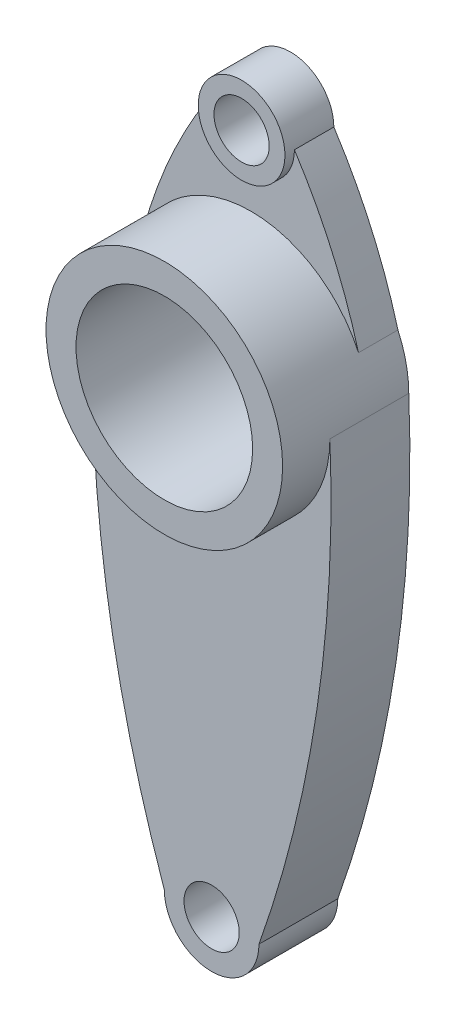
ISO-10303-21;
HEADER;
FILE_DESCRIPTION(('STEP AP214'),'2;1');
FILE_NAME('part.step','',(''),(''),'','','');
FILE_SCHEMA(('AUTOMOTIVE_DESIGN { 1 0 10303 214 1 1 1 1 }'));
ENDSEC;
DATA;
#1=APPLICATION_CONTEXT('core data for automotive mechanical design processes');
#2=APPLICATION_PROTOCOL_DEFINITION('international standard','automotive_design',2000,#1);
#3=PRODUCT_CONTEXT('',#1,'mechanical');
#4=PRODUCT('Part','Part','',(#3));
#5=PRODUCT_RELATED_PRODUCT_CATEGORY('part','',(#4));
#6=PRODUCT_DEFINITION_FORMATION('','',#4);
#7=PRODUCT_DEFINITION_CONTEXT('part definition',#1,'design');
#8=PRODUCT_DEFINITION('design','',#6,#7);
#9=PRODUCT_DEFINITION_SHAPE('','',#8);
#10=(LENGTH_UNIT() NAMED_UNIT(*) SI_UNIT(.MILLI.,.METRE.));
#11=(NAMED_UNIT(*) PLANE_ANGLE_UNIT() SI_UNIT($,.RADIAN.));
#12=(NAMED_UNIT(*) SI_UNIT($,.STERADIAN.) SOLID_ANGLE_UNIT());
#13=UNCERTAINTY_MEASURE_WITH_UNIT(LENGTH_MEASURE(1.E-05),#10,'distance_accuracy_value','');
#14=(GEOMETRIC_REPRESENTATION_CONTEXT(3) GLOBAL_UNCERTAINTY_ASSIGNED_CONTEXT((#13)) GLOBAL_UNIT_ASSIGNED_CONTEXT((#10,
#11,#12)) REPRESENTATION_CONTEXT('',''));
#15=CARTESIAN_POINT('',(0.,0.,0.));
#16=DIRECTION('',(0.,0.,1.));
#17=DIRECTION('',(1.,0.,0.));
#18=AXIS2_PLACEMENT_3D('',#15,#16,#17);
#19=CARTESIAN_POINT('',(0.,0.,5.));
#20=DIRECTION('',(0.,0.,-1.));
#21=DIRECTION('',(-1.,0.,0.));
#22=AXIS2_PLACEMENT_3D('',#19,#20,#21);
#23=PLANE('',#22);
#24=CARTESIAN_POINT('',(0.,24.5,5.));
#25=DIRECTION('',(0.,0.,1.));
#26=DIRECTION('',(1.,0.,0.));
#27=AXIS2_PLACEMENT_3D('',#24,#25,#26);
#28=CIRCLE('',#27,5.5);
#29=CARTESIAN_POINT('',(-5.5,24.5,5.));
#30=VERTEX_POINT('',#29);
#31=CARTESIAN_POINT('',(5.5,24.5,5.));
#32=VERTEX_POINT('',#31);
#33=EDGE_CURVE('E156',#30,#32,#28,.T.);
#34=ORIENTED_EDGE('',*,*,#33,.F.);
#35=CARTESIAN_POINT('',(49.102505457268,-10.7642368099611,5.));
#36=DIRECTION('',(0.,0.,-1.));
#37=DIRECTION('',(-1.,0.,0.));
#38=AXIS2_PLACEMENT_3D('',#35,#36,#37);
#39=CIRCLE('',#38,65.);
#40=CARTESIAN_POINT('',(-13.6243897035963,6.27503029510925,5.));
#41=VERTEX_POINT('',#40);
#42=EDGE_CURVE('E139',#30,#41,#39,.F.);
#43=ORIENTED_EDGE('',*,*,#42,.T.);
#44=CARTESIAN_POINT('',(0.,0.,5.));
#45=DIRECTION('',(0.,0.,-1.));
#46=DIRECTION('',(-1.,0.,0.));
#47=AXIS2_PLACEMENT_3D('',#44,#45,#46);
#48=CIRCLE('',#47,15.);
#49=CARTESIAN_POINT('',(13.6243897035963,6.27503029510925,5.));
#50=VERTEX_POINT('',#49);
#51=EDGE_CURVE('E161',#41,#50,#48,.T.);
#52=ORIENTED_EDGE('',*,*,#51,.T.);
#53=CARTESIAN_POINT('',(-49.102505457268,-10.7642368099611,5.));
#54=DIRECTION('',(0.,0.,-1.));
#55=DIRECTION('',(-1.,0.,0.));
#56=AXIS2_PLACEMENT_3D('',#53,#54,#55);
#57=CIRCLE('',#56,65.);
#58=EDGE_CURVE('E149',#32,#50,#57,.T.);
#59=ORIENTED_EDGE('',*,*,#58,.F.);
#60=EDGE_LOOP('',(#34,#43,#52,#59));
#61=FACE_BOUND('',#60,.T.);
#62=ADVANCED_FACE('F75',(#61),#23,.F.);
#63=CARTESIAN_POINT('',(0.,0.,16.));
#64=DIRECTION('',(0.,0.,1.));
#65=DIRECTION('',(1.,0.,0.));
#66=AXIS2_PLACEMENT_3D('',#63,#64,#65);
#67=PLANE('',#66);
#68=CARTESIAN_POINT('',(0.,0.,16.));
#69=DIRECTION('',(0.,0.,1.));
#70=DIRECTION('',(1.,0.,0.));
#71=AXIS2_PLACEMENT_3D('',#68,#69,#70);
#72=CIRCLE('',#71,15.);
#73=CARTESIAN_POINT('',(15.,0.,16.));
#74=VERTEX_POINT('',#73);
#75=EDGE_CURVE('E12',#74,#74,#72,.T.);
#76=ORIENTED_EDGE('',*,*,#75,.T.);
#77=EDGE_LOOP('',(#76));
#78=FACE_BOUND('',#77,.T.);
#79=CARTESIAN_POINT('',(0.,0.,16.));
#80=DIRECTION('',(0.,0.,1.));
#81=DIRECTION('',(1.,0.,0.));
#82=AXIS2_PLACEMENT_3D('',#79,#80,#81);
#83=CIRCLE('',#82,11.2);
#84=CARTESIAN_POINT('',(11.2,0.,16.));
#85=VERTEX_POINT('',#84);
#86=EDGE_CURVE('E220',#85,#85,#83,.T.);
#87=ORIENTED_EDGE('',*,*,#86,.F.);
#88=EDGE_LOOP('',(#87));
#89=FACE_BOUND('',#88,.T.);
#90=ADVANCED_FACE('F244',(#78,#89),#67,.T.);
#91=CARTESIAN_POINT('',(0.,0.,0.));
#92=DIRECTION('',(0.,0.,1.));
#93=DIRECTION('',(1.,0.,0.));
#94=AXIS2_PLACEMENT_3D('',#91,#92,#93);
#95=PLANE('',#94);
#96=CARTESIAN_POINT('',(0.,0.,0.));
#97=DIRECTION('',(0.,0.,1.));
#98=DIRECTION('',(1.,0.,0.));
#99=AXIS2_PLACEMENT_3D('',#96,#97,#98);
#100=CIRCLE('',#99,15.);
#101=CARTESIAN_POINT('',(-13.6243897035963,6.27503029510925,0.));
#102=VERTEX_POINT('',#101);
#103=CARTESIAN_POINT('',(-15.,-5.46437894932694E-13,0.));
#104=VERTEX_POINT('',#103);
#105=EDGE_CURVE('E79',#102,#104,#100,.T.);
#106=ORIENTED_EDGE('',*,*,#105,.F.);
#107=CARTESIAN_POINT('',(49.102505457268,-10.7642368099611,0.));
#108=DIRECTION('',(0.,0.,-1.));
#109=DIRECTION('',(-1.,0.,0.));
#110=AXIS2_PLACEMENT_3D('',#107,#108,#109);
#111=CIRCLE('',#110,65.);
#112=CARTESIAN_POINT('',(-5.5,24.5,0.));
#113=VERTEX_POINT('',#112);
#114=EDGE_CURVE('E200',#113,#102,#111,.F.);
#115=ORIENTED_EDGE('',*,*,#114,.F.);
#116=CARTESIAN_POINT('',(0.,24.5,0.));
#117=DIRECTION('',(0.,0.,-1.));
#118=DIRECTION('',(-1.,0.,0.));
#119=AXIS2_PLACEMENT_3D('',#116,#117,#118);
#120=CIRCLE('',#119,5.5);
#121=CARTESIAN_POINT('',(5.5,24.5,0.));
#122=VERTEX_POINT('',#121);
#123=EDGE_CURVE('E158',#122,#113,#120,.F.);
#124=ORIENTED_EDGE('',*,*,#123,.F.);
#125=CARTESIAN_POINT('',(-49.102505457268,-10.7642368099611,0.));
#126=DIRECTION('',(0.,0.,-1.));
#127=DIRECTION('',(-1.,0.,0.));
#128=AXIS2_PLACEMENT_3D('',#125,#126,#127);
#129=CIRCLE('',#128,65.);
#130=CARTESIAN_POINT('',(13.6243897035963,6.27503029510924,0.));
#131=VERTEX_POINT('',#130);
#132=EDGE_CURVE('E209',#122,#131,#129,.T.);
#133=ORIENTED_EDGE('',*,*,#132,.T.);
#134=CARTESIAN_POINT('',(15.,0.,0.));
#135=VERTEX_POINT('',#134);
#136=EDGE_CURVE('E223',#135,#131,#100,.T.);
#137=ORIENTED_EDGE('',*,*,#136,.F.);
#138=CARTESIAN_POINT('',(-144.859823688835,-6.69602644667472,0.));
#139=DIRECTION('',(0.,0.,-1.));
#140=DIRECTION('',(-1.,0.,0.));
#141=AXIS2_PLACEMENT_3D('',#138,#139,#140);
#142=CIRCLE('',#141,160.);
#143=CARTESIAN_POINT('',(5.99999999999999,-60.,0.));
#144=VERTEX_POINT('',#143);
#145=EDGE_CURVE('E193',#135,#144,#142,.T.);
#146=ORIENTED_EDGE('',*,*,#145,.T.);
#147=CARTESIAN_POINT('',(0.,-60.,0.));
#148=DIRECTION('',(0.,0.,-1.));
#149=DIRECTION('',(-1.,0.,0.));
#150=AXIS2_PLACEMENT_3D('',#147,#148,#149);
#151=CIRCLE('',#150,6.);
#152=CARTESIAN_POINT('',(-6.00000000000001,-60.,0.));
#153=VERTEX_POINT('',#152);
#154=EDGE_CURVE('E169',#144,#153,#151,.T.);
#155=ORIENTED_EDGE('',*,*,#154,.T.);
#156=CARTESIAN_POINT('',(144.859823688835,-6.69602644667476,0.));
#157=DIRECTION('',(0.,0.,-1.));
#158=DIRECTION('',(-1.,0.,0.));
#159=AXIS2_PLACEMENT_3D('',#156,#157,#158);
#160=CIRCLE('',#159,160.);
#161=EDGE_CURVE('E190',#104,#153,#160,.F.);
#162=ORIENTED_EDGE('',*,*,#161,.F.);
#163=EDGE_LOOP('',(#106,#115,#124,#133,#137,#146,#155,#162));
#164=FACE_BOUND('',#163,.T.);
#165=CARTESIAN_POINT('',(0.,0.,0.));
#166=DIRECTION('',(0.,0.,1.));
#167=DIRECTION('',(1.,0.,0.));
#168=AXIS2_PLACEMENT_3D('',#165,#166,#167);
#169=CIRCLE('',#168,11.2);
#170=CARTESIAN_POINT('',(11.2,0.,0.));
#171=VERTEX_POINT('',#170);
#172=EDGE_CURVE('E215',#171,#171,#169,.T.);
#173=ORIENTED_EDGE('',*,*,#172,.T.);
#174=EDGE_LOOP('',(#173));
#175=FACE_BOUND('',#174,.T.);
#176=CARTESIAN_POINT('',(0.,24.5,0.));
#177=DIRECTION('',(0.,0.,-1.));
#178=DIRECTION('',(-1.,0.,0.));
#179=AXIS2_PLACEMENT_3D('',#176,#177,#178);
#180=CIRCLE('',#179,3.5);
#181=CARTESIAN_POINT('',(-3.5,24.5,0.));
#182=VERTEX_POINT('',#181);
#183=EDGE_CURVE('E150',#182,#182,#180,.F.);
#184=ORIENTED_EDGE('',*,*,#183,.T.);
#185=EDGE_LOOP('',(#184));
#186=FACE_BOUND('',#185,.T.);
#187=CARTESIAN_POINT('',(0.,-60.,0.));
#188=DIRECTION('',(0.,0.,-1.));
#189=DIRECTION('',(-1.,0.,0.));
#190=AXIS2_PLACEMENT_3D('',#187,#188,#189);
#191=CIRCLE('',#190,3.5);
#192=CARTESIAN_POINT('',(-3.50000000000001,-60.,0.));
#193=VERTEX_POINT('',#192);
#194=EDGE_CURVE('E178',#193,#193,#191,.T.);
#195=ORIENTED_EDGE('',*,*,#194,.F.);
#196=EDGE_LOOP('',(#195));
#197=FACE_BOUND('',#196,.T.);
#198=ADVANCED_FACE('F227',(#164,#175,#186,#197),#95,.F.);
#199=CARTESIAN_POINT('',(0.,0.,16.));
#200=DIRECTION('',(0.,0.,-1.));
#201=DIRECTION('',(-1.,0.,0.));
#202=AXIS2_PLACEMENT_3D('',#199,#200,#201);
#203=CYLINDRICAL_SURFACE('',#202,15.);
#204=CARTESIAN_POINT('',(0.,0.,10.));
#205=DIRECTION('',(0.,0.,-1.));
#206=DIRECTION('',(-1.,0.,0.));
#207=AXIS2_PLACEMENT_3D('',#204,#205,#206);
#208=CIRCLE('',#207,15.);
#209=CARTESIAN_POINT('',(15.,-5.47305256670683E-13,10.));
#210=VERTEX_POINT('',#209);
#211=CARTESIAN_POINT('',(-15.,0.,10.));
#212=VERTEX_POINT('',#211);
#213=EDGE_CURVE('E94',#210,#212,#208,.T.);
#214=ORIENTED_EDGE('',*,*,#213,.F.);
#215=DIRECTION('',(0.,0.,-1.));
#216=VECTOR('',#215,1.);
#217=CARTESIAN_POINT('',(15.,0.,10.));
#218=LINE('',#217,#216);
#219=EDGE_CURVE('E201',#210,#135,#218,.T.);
#220=ORIENTED_EDGE('',*,*,#219,.T.);
#221=ORIENTED_EDGE('',*,*,#136,.T.);
#222=DIRECTION('',(0.,0.,-1.));
#223=VECTOR('',#222,1.);
#224=CARTESIAN_POINT('',(13.6243897035963,6.27503029510925,5.));
#225=LINE('',#224,#223);
#226=EDGE_CURVE('E216',#50,#131,#225,.T.);
#227=ORIENTED_EDGE('',*,*,#226,.F.);
#228=ORIENTED_EDGE('',*,*,#51,.F.);
#229=DIRECTION('',(0.,0.,-1.));
#230=VECTOR('',#229,1.);
#231=CARTESIAN_POINT('',(-13.6243897035963,6.27503029510925,5.));
#232=LINE('',#231,#230);
#233=EDGE_CURVE('E145',#41,#102,#232,.T.);
#234=ORIENTED_EDGE('',*,*,#233,.T.);
#235=ORIENTED_EDGE('',*,*,#105,.T.);
#236=DIRECTION('',(0.,0.,-1.));
#237=VECTOR('',#236,1.);
#238=CARTESIAN_POINT('',(-15.,0.,10.));
#239=LINE('',#238,#237);
#240=EDGE_CURVE('E90',#212,#104,#239,.T.);
#241=ORIENTED_EDGE('',*,*,#240,.F.);
#242=EDGE_LOOP('',(#214,#220,#221,#227,#228,#234,#235,#241));
#243=FACE_BOUND('',#242,.T.);
#244=ORIENTED_EDGE('',*,*,#75,.F.);
#245=EDGE_LOOP('',(#244));
#246=FACE_BOUND('',#245,.T.);
#247=ADVANCED_FACE('F77',(#243,#246),#203,.T.);
#248=CARTESIAN_POINT('',(0.,0.,16.));
#249=DIRECTION('',(0.,0.,-1.));
#250=DIRECTION('',(-1.,0.,0.));
#251=AXIS2_PLACEMENT_3D('',#248,#249,#250);
#252=CYLINDRICAL_SURFACE('',#251,11.2);
#253=ORIENTED_EDGE('',*,*,#86,.T.);
#254=EDGE_LOOP('',(#253));
#255=FACE_BOUND('',#254,.T.);
#256=ORIENTED_EDGE('',*,*,#172,.F.);
#257=EDGE_LOOP('',(#256));
#258=FACE_BOUND('',#257,.T.);
#259=ADVANCED_FACE('F230',(#255,#258),#252,.F.);
#260=CARTESIAN_POINT('',(0.,24.5,5.));
#261=DIRECTION('',(0.,0.,-1.));
#262=DIRECTION('',(-1.,0.,0.));
#263=AXIS2_PLACEMENT_3D('',#260,#261,#262);
#264=CYLINDRICAL_SURFACE('',#263,3.5);
#265=ORIENTED_EDGE('',*,*,#183,.F.);
#266=EDGE_LOOP('',(#265));
#267=FACE_BOUND('',#266,.T.);
#268=CARTESIAN_POINT('',(0.,24.5,6.2));
#269=DIRECTION('',(0.,0.,1.));
#270=DIRECTION('',(1.,0.,0.));
#271=AXIS2_PLACEMENT_3D('',#268,#269,#270);
#272=CIRCLE('',#271,3.5);
#273=CARTESIAN_POINT('',(3.5,24.5,6.2));
#274=VERTEX_POINT('',#273);
#275=EDGE_CURVE('E166',#274,#274,#272,.T.);
#276=ORIENTED_EDGE('',*,*,#275,.T.);
#277=EDGE_LOOP('',(#276));
#278=FACE_BOUND('',#277,.T.);
#279=ADVANCED_FACE('F232',(#267,#278),#264,.F.);
#280=CARTESIAN_POINT('',(0.,24.5,5.));
#281=DIRECTION('',(0.,0.,-1.));
#282=DIRECTION('',(-1.,0.,0.));
#283=AXIS2_PLACEMENT_3D('',#280,#281,#282);
#284=CYLINDRICAL_SURFACE('',#283,5.5);
#285=ORIENTED_EDGE('',*,*,#123,.T.);
#286=DIRECTION('',(0.,0.,-1.));
#287=VECTOR('',#286,1.);
#288=CARTESIAN_POINT('',(-5.5,24.5,5.));
#289=LINE('',#288,#287);
#290=EDGE_CURVE('E143',#30,#113,#289,.T.);
#291=ORIENTED_EDGE('',*,*,#290,.F.);
#292=ORIENTED_EDGE('',*,*,#33,.T.);
#293=DIRECTION('',(0.,0.,-1.));
#294=VECTOR('',#293,1.);
#295=CARTESIAN_POINT('',(5.5,24.5,5.));
#296=LINE('',#295,#294);
#297=EDGE_CURVE('E160',#32,#122,#296,.T.);
#298=ORIENTED_EDGE('',*,*,#297,.T.);
#299=EDGE_LOOP('',(#285,#291,#292,#298));
#300=FACE_BOUND('',#299,.T.);
#301=CARTESIAN_POINT('',(0.,24.5,6.2));
#302=DIRECTION('',(0.,0.,1.));
#303=DIRECTION('',(1.,0.,0.));
#304=AXIS2_PLACEMENT_3D('',#301,#302,#303);
#305=CIRCLE('',#304,5.5);
#306=CARTESIAN_POINT('',(5.5,24.5,6.2));
#307=VERTEX_POINT('',#306);
#308=EDGE_CURVE('E165',#307,#307,#305,.T.);
#309=ORIENTED_EDGE('',*,*,#308,.F.);
#310=EDGE_LOOP('',(#309));
#311=FACE_BOUND('',#310,.T.);
#312=ADVANCED_FACE('F154',(#300,#311),#284,.T.);
#313=CARTESIAN_POINT('',(-49.102505457268,-10.7642368099611,5.));
#314=DIRECTION('',(0.,0.,-1.));
#315=DIRECTION('',(-1.,0.,0.));
#316=AXIS2_PLACEMENT_3D('',#313,#314,#315);
#317=CYLINDRICAL_SURFACE('',#316,65.);
#318=ORIENTED_EDGE('',*,*,#132,.F.);
#319=ORIENTED_EDGE('',*,*,#297,.F.);
#320=ORIENTED_EDGE('',*,*,#58,.T.);
#321=ORIENTED_EDGE('',*,*,#226,.T.);
#322=EDGE_LOOP('',(#318,#319,#320,#321));
#323=FACE_BOUND('',#322,.T.);
#324=ADVANCED_FACE('F254',(#323),#317,.T.);
#325=CARTESIAN_POINT('',(49.102505457268,-10.7642368099611,5.));
#326=DIRECTION('',(0.,0.,-1.));
#327=DIRECTION('',(-1.,0.,0.));
#328=AXIS2_PLACEMENT_3D('',#325,#326,#327);
#329=CYLINDRICAL_SURFACE('',#328,65.);
#330=ORIENTED_EDGE('',*,*,#114,.T.);
#331=ORIENTED_EDGE('',*,*,#233,.F.);
#332=ORIENTED_EDGE('',*,*,#42,.F.);
#333=ORIENTED_EDGE('',*,*,#290,.T.);
#334=EDGE_LOOP('',(#330,#331,#332,#333));
#335=FACE_BOUND('',#334,.T.);
#336=ADVANCED_FACE('F142',(#335),#329,.T.);
#337=CARTESIAN_POINT('',(0.,-60.,10.));
#338=DIRECTION('',(0.,0.,-1.));
#339=DIRECTION('',(-1.,0.,0.));
#340=AXIS2_PLACEMENT_3D('',#337,#338,#339);
#341=CYLINDRICAL_SURFACE('',#340,6.);
#342=ORIENTED_EDGE('',*,*,#154,.F.);
#343=DIRECTION('',(0.,0.,-1.));
#344=VECTOR('',#343,1.);
#345=CARTESIAN_POINT('',(5.99999999999999,-60.,10.));
#346=LINE('',#345,#344);
#347=CARTESIAN_POINT('',(5.99999999999999,-60.,10.));
#348=VERTEX_POINT('',#347);
#349=EDGE_CURVE('E198',#348,#144,#346,.T.);
#350=ORIENTED_EDGE('',*,*,#349,.F.);
#351=CARTESIAN_POINT('',(0.,-60.,10.));
#352=DIRECTION('',(0.,0.,-1.));
#353=DIRECTION('',(-1.,0.,0.));
#354=AXIS2_PLACEMENT_3D('',#351,#352,#353);
#355=CIRCLE('',#354,6.);
#356=CARTESIAN_POINT('',(-6.00000000000001,-60.,10.));
#357=VERTEX_POINT('',#356);
#358=EDGE_CURVE('E174',#348,#357,#355,.T.);
#359=ORIENTED_EDGE('',*,*,#358,.T.);
#360=DIRECTION('',(0.,0.,-1.));
#361=VECTOR('',#360,1.);
#362=CARTESIAN_POINT('',(-6.00000000000001,-60.,10.));
#363=LINE('',#362,#361);
#364=EDGE_CURVE('E187',#357,#153,#363,.T.);
#365=ORIENTED_EDGE('',*,*,#364,.T.);
#366=EDGE_LOOP('',(#342,#350,#359,#365));
#367=FACE_BOUND('',#366,.T.);
#368=ADVANCED_FACE('F251',(#367),#341,.T.);
#369=CARTESIAN_POINT('',(-144.859823688835,-6.69602644667472,10.));
#370=DIRECTION('',(0.,0.,-1.));
#371=DIRECTION('',(-1.,0.,0.));
#372=AXIS2_PLACEMENT_3D('',#369,#370,#371);
#373=CYLINDRICAL_SURFACE('',#372,160.);
#374=ORIENTED_EDGE('',*,*,#145,.F.);
#375=ORIENTED_EDGE('',*,*,#219,.F.);
#376=CARTESIAN_POINT('',(-144.859823688835,-6.69602644667472,10.));
#377=DIRECTION('',(0.,0.,-1.));
#378=DIRECTION('',(-1.,0.,0.));
#379=AXIS2_PLACEMENT_3D('',#376,#377,#378);
#380=CIRCLE('',#379,160.);
#381=EDGE_CURVE('E181',#210,#348,#380,.T.);
#382=ORIENTED_EDGE('',*,*,#381,.T.);
#383=ORIENTED_EDGE('',*,*,#349,.T.);
#384=EDGE_LOOP('',(#374,#375,#382,#383));
#385=FACE_BOUND('',#384,.T.);
#386=ADVANCED_FACE('F263',(#385),#373,.T.);
#387=CARTESIAN_POINT('',(144.859823688835,-6.69602644667476,10.));
#388=DIRECTION('',(0.,0.,-1.));
#389=DIRECTION('',(-1.,0.,0.));
#390=AXIS2_PLACEMENT_3D('',#387,#388,#389);
#391=CYLINDRICAL_SURFACE('',#390,160.);
#392=ORIENTED_EDGE('',*,*,#161,.T.);
#393=ORIENTED_EDGE('',*,*,#364,.F.);
#394=CARTESIAN_POINT('',(144.859823688835,-6.69602644667476,10.));
#395=DIRECTION('',(0.,0.,-1.));
#396=DIRECTION('',(-1.,0.,0.));
#397=AXIS2_PLACEMENT_3D('',#394,#395,#396);
#398=CIRCLE('',#397,160.);
#399=EDGE_CURVE('E177',#212,#357,#398,.F.);
#400=ORIENTED_EDGE('',*,*,#399,.F.);
#401=ORIENTED_EDGE('',*,*,#240,.T.);
#402=EDGE_LOOP('',(#392,#393,#400,#401));
#403=FACE_BOUND('',#402,.T.);
#404=ADVANCED_FACE('F268',(#403),#391,.T.);
#405=CARTESIAN_POINT('',(0.,-60.,10.));
#406=DIRECTION('',(0.,0.,-1.));
#407=DIRECTION('',(-1.,0.,0.));
#408=AXIS2_PLACEMENT_3D('',#405,#406,#407);
#409=CYLINDRICAL_SURFACE('',#408,3.5);
#410=CARTESIAN_POINT('',(0.,-60.,10.));
#411=DIRECTION('',(0.,0.,-1.));
#412=DIRECTION('',(-1.,0.,0.));
#413=AXIS2_PLACEMENT_3D('',#410,#411,#412);
#414=CIRCLE('',#413,3.5);
#415=CARTESIAN_POINT('',(-3.50000000000001,-60.,10.));
#416=VERTEX_POINT('',#415);
#417=EDGE_CURVE('E184',#416,#416,#414,.T.);
#418=ORIENTED_EDGE('',*,*,#417,.F.);
#419=EDGE_LOOP('',(#418));
#420=FACE_BOUND('',#419,.T.);
#421=ORIENTED_EDGE('',*,*,#194,.T.);
#422=EDGE_LOOP('',(#421));
#423=FACE_BOUND('',#422,.T.);
#424=ADVANCED_FACE('F290',(#420,#423),#409,.F.);
#425=CARTESIAN_POINT('',(0.,0.,10.));
#426=DIRECTION('',(0.,0.,-1.));
#427=DIRECTION('',(-1.,0.,0.));
#428=AXIS2_PLACEMENT_3D('',#425,#426,#427);
#429=PLANE('',#428);
#430=ORIENTED_EDGE('',*,*,#358,.F.);
#431=ORIENTED_EDGE('',*,*,#381,.F.);
#432=ORIENTED_EDGE('',*,*,#213,.T.);
#433=ORIENTED_EDGE('',*,*,#399,.T.);
#434=EDGE_LOOP('',(#430,#431,#432,#433));
#435=FACE_BOUND('',#434,.T.);
#436=ORIENTED_EDGE('',*,*,#417,.T.);
#437=EDGE_LOOP('',(#436));
#438=FACE_BOUND('',#437,.T.);
#439=ADVANCED_FACE('F280',(#435,#438),#429,.F.);
#440=CARTESIAN_POINT('',(0.,24.5,6.2));
#441=DIRECTION('',(0.,0.,1.));
#442=DIRECTION('',(1.,0.,0.));
#443=AXIS2_PLACEMENT_3D('',#440,#441,#442);
#444=PLANE('',#443);
#445=ORIENTED_EDGE('',*,*,#308,.T.);
#446=EDGE_LOOP('',(#445));
#447=FACE_BOUND('',#446,.T.);
#448=ORIENTED_EDGE('',*,*,#275,.F.);
#449=EDGE_LOOP('',(#448));
#450=FACE_BOUND('',#449,.T.);
#451=ADVANCED_FACE('F299',(#447,#450),#444,.T.);
#452=CLOSED_SHELL('',(#62,#90,#198,#247,#259,#279,#312,#324,#336,#368,#386,#404,#424,#439,#451));
#453=MANIFOLD_SOLID_BREP('B2',#452);
#454=ADVANCED_BREP_SHAPE_REPRESENTATION('',(#18,#453),#14);
#455=SHAPE_DEFINITION_REPRESENTATION(#9,#454);
ENDSEC;
END-ISO-10303-21;
